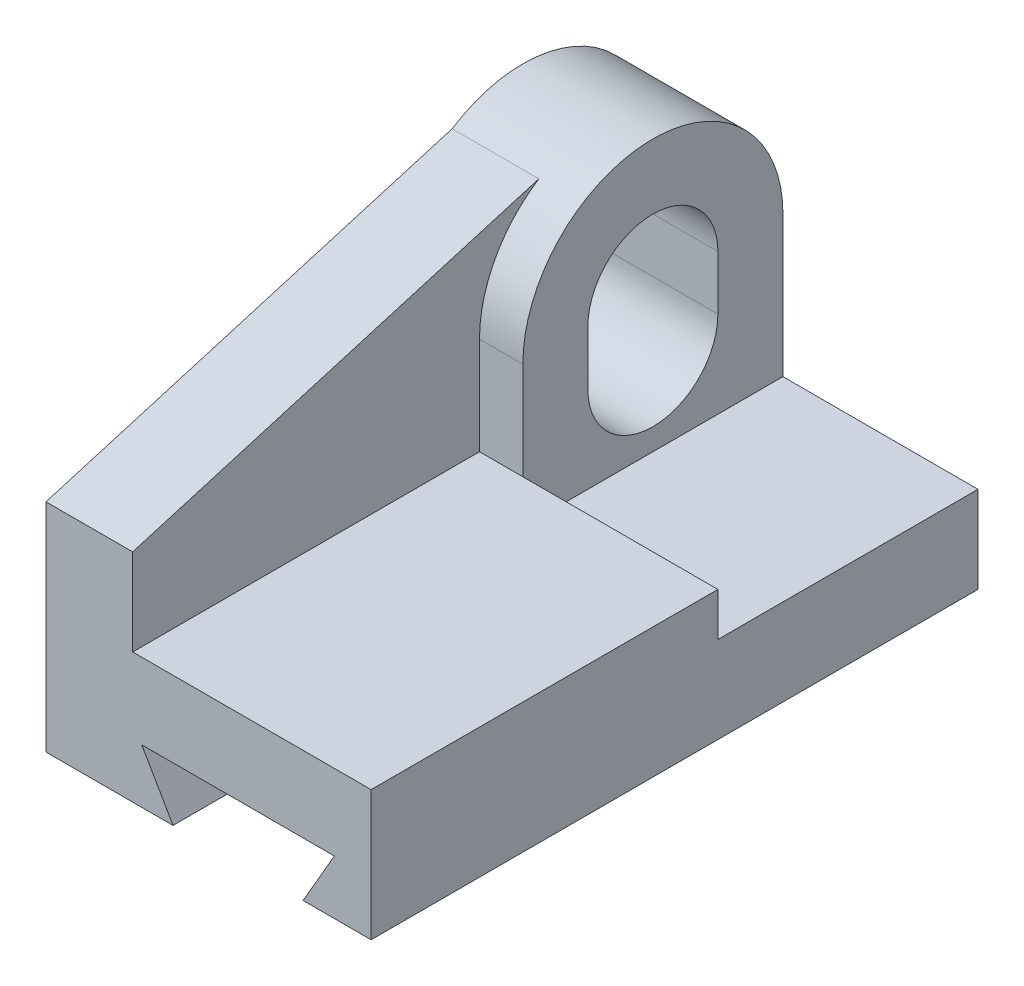
ISO-10303-21;
HEADER;
FILE_DESCRIPTION(('STEP AP214'),'2;1');
FILE_NAME('part.step','',(''),(''),'','','');
FILE_SCHEMA(('AUTOMOTIVE_DESIGN { 1 0 10303 214 1 1 1 1 }'));
ENDSEC;
DATA;
#1=APPLICATION_CONTEXT('core data for automotive mechanical design processes');
#2=APPLICATION_PROTOCOL_DEFINITION('international standard','automotive_design',2000,#1);
#3=PRODUCT_CONTEXT('',#1,'mechanical');
#4=PRODUCT('Part','Part','',(#3));
#5=PRODUCT_RELATED_PRODUCT_CATEGORY('part','',(#4));
#6=PRODUCT_DEFINITION_FORMATION('','',#4);
#7=PRODUCT_DEFINITION_CONTEXT('part definition',#1,'design');
#8=PRODUCT_DEFINITION('design','',#6,#7);
#9=PRODUCT_DEFINITION_SHAPE('','',#8);
#10=(LENGTH_UNIT() NAMED_UNIT(*) SI_UNIT(.MILLI.,.METRE.));
#11=(NAMED_UNIT(*) PLANE_ANGLE_UNIT() SI_UNIT($,.RADIAN.));
#12=(NAMED_UNIT(*) SI_UNIT($,.STERADIAN.) SOLID_ANGLE_UNIT());
#13=UNCERTAINTY_MEASURE_WITH_UNIT(LENGTH_MEASURE(1.E-05),#10,'distance_accuracy_value','');
#14=(GEOMETRIC_REPRESENTATION_CONTEXT(3) GLOBAL_UNCERTAINTY_ASSIGNED_CONTEXT((#13)) GLOBAL_UNIT_ASSIGNED_CONTEXT((#10,
#11,#12)) REPRESENTATION_CONTEXT('',''));
#15=CARTESIAN_POINT('',(0.,0.,0.));
#16=DIRECTION('',(0.,0.,1.));
#17=DIRECTION('',(1.,0.,0.));
#18=AXIS2_PLACEMENT_3D('',#15,#16,#17);
#19=CARTESIAN_POINT('',(30.,0.,0.));
#20=DIRECTION('',(0.,1.,0.));
#21=DIRECTION('',(0.,0.,1.));
#22=AXIS2_PLACEMENT_3D('',#19,#20,#21);
#23=PLANE('',#22);
#24=DIRECTION('',(-1.,0.,0.));
#25=VECTOR('',#24,1.);
#26=CARTESIAN_POINT('',(30.,0.,-56.));
#27=LINE('',#26,#25);
#28=CARTESIAN_POINT('',(11.7207890482263,0.,-56.));
#29=VERTEX_POINT('',#28);
#30=CARTESIAN_POINT('',(0.,0.,-56.));
#31=VERTEX_POINT('',#30);
#32=EDGE_CURVE('E196',#29,#31,#27,.T.);
#33=ORIENTED_EDGE('',*,*,#32,.F.);
#34=DIRECTION('',(0.,0.,1.));
#35=VECTOR('',#34,1.);
#36=CARTESIAN_POINT('',(11.7207890482263,0.,-56.));
#37=LINE('',#36,#35);
#38=CARTESIAN_POINT('',(11.7207890482263,0.,0.));
#39=VERTEX_POINT('',#38);
#40=EDGE_CURVE('E226',#29,#39,#37,.T.);
#41=ORIENTED_EDGE('',*,*,#40,.T.);
#42=DIRECTION('',(-1.,0.,0.));
#43=VECTOR('',#42,1.);
#44=CARTESIAN_POINT('',(30.,0.,0.));
#45=LINE('',#44,#43);
#46=CARTESIAN_POINT('',(0.,0.,0.));
#47=VERTEX_POINT('',#46);
#48=EDGE_CURVE('E195',#39,#47,#45,.T.);
#49=ORIENTED_EDGE('',*,*,#48,.T.);
#50=DIRECTION('',(0.,0.,-1.));
#51=VECTOR('',#50,1.);
#52=CARTESIAN_POINT('',(0.,0.,0.));
#53=LINE('',#52,#51);
#54=EDGE_CURVE('E307',#47,#31,#53,.T.);
#55=ORIENTED_EDGE('',*,*,#54,.T.);
#56=EDGE_LOOP('',(#33,#41,#49,#55));
#57=FACE_BOUND('',#56,.T.);
#58=ADVANCED_FACE('F43',(#57),#23,.F.);
#59=CARTESIAN_POINT('',(30.,12.,0.));
#60=DIRECTION('',(0.,1.,0.));
#61=DIRECTION('',(0.,0.,1.));
#62=AXIS2_PLACEMENT_3D('',#59,#60,#61);
#63=PLANE('',#62);
#64=DIRECTION('',(-1.,0.,0.));
#65=VECTOR('',#64,1.);
#66=CARTESIAN_POINT('',(30.,12.,-32.));
#67=LINE('',#66,#65);
#68=CARTESIAN_POINT('',(12.,12.,-32.));
#69=VERTEX_POINT('',#68);
#70=CARTESIAN_POINT('',(8.,12.,-32.));
#71=VERTEX_POINT('',#70);
#72=EDGE_CURVE('E277',#69,#71,#67,.T.);
#73=ORIENTED_EDGE('',*,*,#72,.T.);
#74=DIRECTION('',(0.,0.,-1.));
#75=VECTOR('',#74,1.);
#76=CARTESIAN_POINT('',(8.,12.,0.));
#77=LINE('',#76,#75);
#78=CARTESIAN_POINT('',(8.,12.,0.));
#79=VERTEX_POINT('',#78);
#80=EDGE_CURVE('E66',#79,#71,#77,.T.);
#81=ORIENTED_EDGE('',*,*,#80,.F.);
#82=DIRECTION('',(-1.,0.,0.));
#83=VECTOR('',#82,1.);
#84=CARTESIAN_POINT('',(30.,12.,0.));
#85=LINE('',#84,#83);
#86=CARTESIAN_POINT('',(30.,12.,0.));
#87=VERTEX_POINT('',#86);
#88=EDGE_CURVE('E51',#87,#79,#85,.T.);
#89=ORIENTED_EDGE('',*,*,#88,.F.);
#90=DIRECTION('',(0.,0.,-1.));
#91=VECTOR('',#90,1.);
#92=CARTESIAN_POINT('',(30.,12.,0.));
#93=LINE('',#92,#91);
#94=CARTESIAN_POINT('',(30.,12.,-32.));
#95=VERTEX_POINT('',#94);
#96=EDGE_CURVE('E295',#87,#95,#93,.T.);
#97=ORIENTED_EDGE('',*,*,#96,.T.);
#98=DIRECTION('',(-1.,0.,0.));
#99=VECTOR('',#98,1.);
#100=CARTESIAN_POINT('',(30.,12.,-32.));
#101=LINE('',#100,#99);
#102=EDGE_CURVE('E11',#95,#69,#101,.T.);
#103=ORIENTED_EDGE('',*,*,#102,.T.);
#104=EDGE_LOOP('',(#73,#81,#89,#97,#103));
#105=FACE_BOUND('',#104,.T.);
#106=ADVANCED_FACE('F325',(#105),#63,.T.);
#107=CARTESIAN_POINT('',(12.,0.,-32.));
#108=DIRECTION('',(0.,0.,-1.));
#109=DIRECTION('',(-1.,0.,0.));
#110=AXIS2_PLACEMENT_3D('',#107,#108,#109);
#111=PLANE('',#110);
#112=DIRECTION('',(0.,1.,0.));
#113=VECTOR('',#112,1.);
#114=CARTESIAN_POINT('',(8.,0.,-32.));
#115=LINE('',#114,#113);
#116=CARTESIAN_POINT('',(8.,21.,-32.));
#117=VERTEX_POINT('',#116);
#118=EDGE_CURVE('E231',#71,#117,#115,.T.);
#119=ORIENTED_EDGE('',*,*,#118,.F.);
#120=ORIENTED_EDGE('',*,*,#72,.F.);
#121=DIRECTION('',(0.,-1.,0.));
#122=VECTOR('',#121,1.);
#123=CARTESIAN_POINT('',(12.,0.,-32.));
#124=LINE('',#123,#122);
#125=CARTESIAN_POINT('',(12.,21.,-32.));
#126=VERTEX_POINT('',#125);
#127=EDGE_CURVE('E252',#126,#69,#124,.T.);
#128=ORIENTED_EDGE('',*,*,#127,.F.);
#129=DIRECTION('',(-1.,0.,0.));
#130=VECTOR('',#129,1.);
#131=CARTESIAN_POINT('',(12.,21.,-32.));
#132=LINE('',#131,#130);
#133=EDGE_CURVE('E278',#126,#117,#132,.T.);
#134=ORIENTED_EDGE('',*,*,#133,.T.);
#135=EDGE_LOOP('',(#119,#120,#128,#134));
#136=FACE_BOUND('',#135,.T.);
#137=ADVANCED_FACE('F349',(#136),#111,.F.);
#138=CARTESIAN_POINT('',(12.,21.,-44.));
#139=DIRECTION('',(-1.,0.,0.));
#140=DIRECTION('',(0.,0.,1.));
#141=AXIS2_PLACEMENT_3D('',#138,#139,#140);
#142=CYLINDRICAL_SURFACE('',#141,12.);
#143=DIRECTION('',(-1.,0.,0.));
#144=VECTOR('',#143,1.);
#145=CARTESIAN_POINT('',(8.,31.0731591448931,-37.4783847980998));
#146=LINE('',#145,#144);
#147=CARTESIAN_POINT('',(8.,31.0731591448931,-37.4783847980998));
#148=VERTEX_POINT('',#147);
#149=CARTESIAN_POINT('',(0.,31.0731591448931,-37.4783847980998));
#150=VERTEX_POINT('',#149);
#151=EDGE_CURVE('E235',#148,#150,#146,.T.);
#152=ORIENTED_EDGE('',*,*,#151,.F.);
#153=CARTESIAN_POINT('',(8.,21.,-44.));
#154=DIRECTION('',(-1.,0.,0.));
#155=DIRECTION('',(0.,0.,1.));
#156=AXIS2_PLACEMENT_3D('',#153,#154,#155);
#157=CIRCLE('',#156,12.);
#158=EDGE_CURVE('E223',#117,#148,#157,.T.);
#159=ORIENTED_EDGE('',*,*,#158,.F.);
#160=ORIENTED_EDGE('',*,*,#133,.F.);
#161=CARTESIAN_POINT('',(12.,21.,-44.));
#162=DIRECTION('',(-1.,0.,0.));
#163=DIRECTION('',(0.,0.,1.));
#164=AXIS2_PLACEMENT_3D('',#161,#162,#163);
#165=CIRCLE('',#164,12.);
#166=CARTESIAN_POINT('',(12.,21.,-56.));
#167=VERTEX_POINT('',#166);
#168=EDGE_CURVE('E255',#167,#126,#165,.F.);
#169=ORIENTED_EDGE('',*,*,#168,.F.);
#170=DIRECTION('',(-1.,0.,0.));
#171=VECTOR('',#170,1.);
#172=CARTESIAN_POINT('',(12.,21.,-56.));
#173=LINE('',#172,#171);
#174=CARTESIAN_POINT('',(0.,21.,-56.));
#175=VERTEX_POINT('',#174);
#176=EDGE_CURVE('E274',#167,#175,#173,.T.);
#177=ORIENTED_EDGE('',*,*,#176,.T.);
#178=CARTESIAN_POINT('',(0.,21.,-44.));
#179=DIRECTION('',(-1.,0.,0.));
#180=DIRECTION('',(0.,0.,1.));
#181=AXIS2_PLACEMENT_3D('',#178,#179,#180);
#182=CIRCLE('',#181,12.);
#183=EDGE_CURVE('E244',#175,#150,#182,.F.);
#184=ORIENTED_EDGE('',*,*,#183,.T.);
#185=EDGE_LOOP('',(#152,#159,#160,#169,#177,#184));
#186=FACE_BOUND('',#185,.T.);
#187=ADVANCED_FACE('F362',(#186),#142,.T.);
#188=CARTESIAN_POINT('',(30.,0.,-32.));
#189=DIRECTION('',(0.,0.,-1.));
#190=DIRECTION('',(-1.,0.,0.));
#191=AXIS2_PLACEMENT_3D('',#188,#189,#190);
#192=PLANE('',#191);
#193=DIRECTION('',(-1.,0.,0.));
#194=VECTOR('',#193,1.);
#195=CARTESIAN_POINT('',(30.,8.,-32.));
#196=LINE('',#195,#194);
#197=CARTESIAN_POINT('',(30.,8.,-32.));
#198=VERTEX_POINT('',#197);
#199=CARTESIAN_POINT('',(12.,8.,-32.));
#200=VERTEX_POINT('',#199);
#201=EDGE_CURVE('E305',#198,#200,#196,.T.);
#202=ORIENTED_EDGE('',*,*,#201,.T.);
#203=EDGE_CURVE('E251',#69,#200,#124,.T.);
#204=ORIENTED_EDGE('',*,*,#203,.F.);
#205=ORIENTED_EDGE('',*,*,#102,.F.);
#206=DIRECTION('',(0.,-1.,0.));
#207=VECTOR('',#206,1.);
#208=CARTESIAN_POINT('',(30.,0.,-32.));
#209=LINE('',#208,#207);
#210=EDGE_CURVE('E292',#95,#198,#209,.T.);
#211=ORIENTED_EDGE('',*,*,#210,.T.);
#212=EDGE_LOOP('',(#202,#204,#205,#211));
#213=FACE_BOUND('',#212,.T.);
#214=ADVANCED_FACE('F45',(#213),#192,.T.);
#215=CARTESIAN_POINT('',(30.,8.,0.));
#216=DIRECTION('',(0.,1.,0.));
#217=DIRECTION('',(0.,0.,1.));
#218=AXIS2_PLACEMENT_3D('',#215,#216,#217);
#219=PLANE('',#218);
#220=DIRECTION('',(-1.,0.,0.));
#221=VECTOR('',#220,1.);
#222=CARTESIAN_POINT('',(30.,8.,-56.));
#223=LINE('',#222,#221);
#224=CARTESIAN_POINT('',(30.,8.,-56.));
#225=VERTEX_POINT('',#224);
#226=CARTESIAN_POINT('',(12.,8.,-56.));
#227=VERTEX_POINT('',#226);
#228=EDGE_CURVE('E199',#225,#227,#223,.T.);
#229=ORIENTED_EDGE('',*,*,#228,.T.);
#230=DIRECTION('',(0.,0.,-1.));
#231=VECTOR('',#230,1.);
#232=CARTESIAN_POINT('',(12.,8.,0.));
#233=LINE('',#232,#231);
#234=EDGE_CURVE('E260',#200,#227,#233,.T.);
#235=ORIENTED_EDGE('',*,*,#234,.F.);
#236=ORIENTED_EDGE('',*,*,#201,.F.);
#237=DIRECTION('',(0.,0.,-1.));
#238=VECTOR('',#237,1.);
#239=CARTESIAN_POINT('',(30.,8.,0.));
#240=LINE('',#239,#238);
#241=EDGE_CURVE('E302',#198,#225,#240,.T.);
#242=ORIENTED_EDGE('',*,*,#241,.T.);
#243=EDGE_LOOP('',(#229,#235,#236,#242));
#244=FACE_BOUND('',#243,.T.);
#245=ADVANCED_FACE('F316',(#244),#219,.T.);
#246=CARTESIAN_POINT('',(30.,0.,0.));
#247=DIRECTION('',(0.,0.,1.));
#248=DIRECTION('',(1.,0.,0.));
#249=AXIS2_PLACEMENT_3D('',#246,#247,#248);
#250=PLANE('',#249);
#251=DIRECTION('',(0.499999999999998,-0.86602540378444,0.));
#252=VECTOR('',#251,1.);
#253=CARTESIAN_POINT('',(11.7207890482263,0.,0.));
#254=LINE('',#253,#252);
#255=CARTESIAN_POINT('',(8.83403770227823,5.,0.));
#256=VERTEX_POINT('',#255);
#257=EDGE_CURVE('E180',#256,#39,#254,.T.);
#258=ORIENTED_EDGE('',*,*,#257,.F.);
#259=DIRECTION('',(-1.,0.,0.));
#260=VECTOR('',#259,1.);
#261=CARTESIAN_POINT('',(8.83403770227823,5.,0.));
#262=LINE('',#261,#260);
#263=CARTESIAN_POINT('',(26.6075403941745,5.,0.));
#264=VERTEX_POINT('',#263);
#265=EDGE_CURVE('E428',#264,#256,#262,.T.);
#266=ORIENTED_EDGE('',*,*,#265,.F.);
#267=DIRECTION('',(0.499999999999998,0.86602540378444,0.));
#268=VECTOR('',#267,1.);
#269=CARTESIAN_POINT('',(23.7207890482264,0.,0.));
#270=LINE('',#269,#268);
#271=CARTESIAN_POINT('',(23.7207890482264,0.,0.));
#272=VERTEX_POINT('',#271);
#273=EDGE_CURVE('E439',#272,#264,#270,.T.);
#274=ORIENTED_EDGE('',*,*,#273,.F.);
#275=CARTESIAN_POINT('',(30.,0.,0.));
#276=VERTEX_POINT('',#275);
#277=EDGE_CURVE('E189',#276,#272,#45,.T.);
#278=ORIENTED_EDGE('',*,*,#277,.F.);
#279=DIRECTION('',(0.,1.,0.));
#280=VECTOR('',#279,1.);
#281=CARTESIAN_POINT('',(30.,0.,0.));
#282=LINE('',#281,#280);
#283=EDGE_CURVE('E211',#276,#87,#282,.T.);
#284=ORIENTED_EDGE('',*,*,#283,.T.);
#285=ORIENTED_EDGE('',*,*,#88,.T.);
#286=DIRECTION('',(0.,-1.,0.));
#287=VECTOR('',#286,1.);
#288=CARTESIAN_POINT('',(8.,0.,0.));
#289=LINE('',#288,#287);
#290=CARTESIAN_POINT('',(8.,20.,0.));
#291=VERTEX_POINT('',#290);
#292=EDGE_CURVE('E209',#291,#79,#289,.T.);
#293=ORIENTED_EDGE('',*,*,#292,.F.);
#294=DIRECTION('',(-1.,0.,0.));
#295=VECTOR('',#294,1.);
#296=CARTESIAN_POINT('',(8.,20.,0.));
#297=LINE('',#296,#295);
#298=CARTESIAN_POINT('',(0.,20.,0.));
#299=VERTEX_POINT('',#298);
#300=EDGE_CURVE('E233',#291,#299,#297,.T.);
#301=ORIENTED_EDGE('',*,*,#300,.T.);
#302=DIRECTION('',(0.,1.,0.));
#303=VECTOR('',#302,1.);
#304=CARTESIAN_POINT('',(0.,0.,0.));
#305=LINE('',#304,#303);
#306=EDGE_CURVE('E291',#47,#299,#305,.T.);
#307=ORIENTED_EDGE('',*,*,#306,.F.);
#308=ORIENTED_EDGE('',*,*,#48,.F.);
#309=EDGE_LOOP('',(#258,#266,#274,#278,#284,#285,#293,#301,#307,#308));
#310=FACE_BOUND('',#309,.T.);
#311=ADVANCED_FACE('F207',(#310),#250,.T.);
#312=ORIENTED_EDGE('',*,*,#277,.T.);
#313=DIRECTION('',(0.,0.,1.));
#314=VECTOR('',#313,1.);
#315=CARTESIAN_POINT('',(23.7207890482264,0.,-56.));
#316=LINE('',#315,#314);
#317=CARTESIAN_POINT('',(23.7207890482264,0.,-56.));
#318=VERTEX_POINT('',#317);
#319=EDGE_CURVE('E175',#318,#272,#316,.T.);
#320=ORIENTED_EDGE('',*,*,#319,.F.);
#321=CARTESIAN_POINT('',(30.,0.,-56.));
#322=VERTEX_POINT('',#321);
#323=EDGE_CURVE('E187',#322,#318,#27,.T.);
#324=ORIENTED_EDGE('',*,*,#323,.F.);
#325=DIRECTION('',(0.,0.,-1.));
#326=VECTOR('',#325,1.);
#327=CARTESIAN_POINT('',(30.,0.,0.));
#328=LINE('',#327,#326);
#329=EDGE_CURVE('E299',#276,#322,#328,.T.);
#330=ORIENTED_EDGE('',*,*,#329,.F.);
#331=EDGE_LOOP('',(#312,#320,#324,#330));
#332=FACE_BOUND('',#331,.T.);
#333=ADVANCED_FACE('F185',(#332),#23,.F.);
#334=CARTESIAN_POINT('',(30.,0.,-56.));
#335=DIRECTION('',(0.,0.,1.));
#336=DIRECTION('',(1.,0.,0.));
#337=AXIS2_PLACEMENT_3D('',#334,#335,#336);
#338=PLANE('',#337);
#339=DIRECTION('',(-1.,0.,0.));
#340=VECTOR('',#339,1.);
#341=CARTESIAN_POINT('',(8.83403770227823,5.,-56.));
#342=LINE('',#341,#340);
#343=CARTESIAN_POINT('',(26.6075403941745,5.,-56.));
#344=VERTEX_POINT('',#343);
#345=CARTESIAN_POINT('',(8.83403770227823,5.,-56.));
#346=VERTEX_POINT('',#345);
#347=EDGE_CURVE('E58',#344,#346,#342,.T.);
#348=ORIENTED_EDGE('',*,*,#347,.T.);
#349=DIRECTION('',(0.499999999999998,-0.86602540378444,0.));
#350=VECTOR('',#349,1.);
#351=CARTESIAN_POINT('',(11.7207890482263,0.,-56.));
#352=LINE('',#351,#350);
#353=EDGE_CURVE('E190',#346,#29,#352,.T.);
#354=ORIENTED_EDGE('',*,*,#353,.T.);
#355=ORIENTED_EDGE('',*,*,#32,.T.);
#356=DIRECTION('',(0.,1.,0.));
#357=VECTOR('',#356,1.);
#358=CARTESIAN_POINT('',(0.,0.,-56.));
#359=LINE('',#358,#357);
#360=EDGE_CURVE('E296',#31,#175,#359,.T.);
#361=ORIENTED_EDGE('',*,*,#360,.T.);
#362=ORIENTED_EDGE('',*,*,#176,.F.);
#363=DIRECTION('',(0.,-1.,0.));
#364=VECTOR('',#363,1.);
#365=CARTESIAN_POINT('',(12.,0.,-56.));
#366=LINE('',#365,#364);
#367=EDGE_CURVE('E257',#167,#227,#366,.T.);
#368=ORIENTED_EDGE('',*,*,#367,.T.);
#369=ORIENTED_EDGE('',*,*,#228,.F.);
#370=DIRECTION('',(0.,1.,0.));
#371=VECTOR('',#370,1.);
#372=CARTESIAN_POINT('',(30.,0.,-56.));
#373=LINE('',#372,#371);
#374=EDGE_CURVE('E194',#322,#225,#373,.T.);
#375=ORIENTED_EDGE('',*,*,#374,.F.);
#376=ORIENTED_EDGE('',*,*,#323,.T.);
#377=DIRECTION('',(0.499999999999998,0.86602540378444,0.));
#378=VECTOR('',#377,1.);
#379=CARTESIAN_POINT('',(23.7207890482264,0.,-56.));
#380=LINE('',#379,#378);
#381=EDGE_CURVE('E171',#318,#344,#380,.T.);
#382=ORIENTED_EDGE('',*,*,#381,.T.);
#383=EDGE_LOOP('',(#348,#354,#355,#361,#362,#368,#369,#375,#376,#382));
#384=FACE_BOUND('',#383,.T.);
#385=ADVANCED_FACE('F192',(#384),#338,.F.);
#386=CARTESIAN_POINT('',(30.,0.,0.));
#387=DIRECTION('',(1.,0.,0.));
#388=DIRECTION('',(0.,0.,-1.));
#389=AXIS2_PLACEMENT_3D('',#386,#387,#388);
#390=PLANE('',#389);
#391=ORIENTED_EDGE('',*,*,#210,.F.);
#392=ORIENTED_EDGE('',*,*,#96,.F.);
#393=ORIENTED_EDGE('',*,*,#283,.F.);
#394=ORIENTED_EDGE('',*,*,#329,.T.);
#395=ORIENTED_EDGE('',*,*,#374,.T.);
#396=ORIENTED_EDGE('',*,*,#241,.F.);
#397=EDGE_LOOP('',(#391,#392,#393,#394,#395,#396));
#398=FACE_BOUND('',#397,.T.);
#399=ADVANCED_FACE('F327',(#398),#390,.T.);
#400=CARTESIAN_POINT('',(0.,0.,0.));
#401=DIRECTION('',(1.,0.,0.));
#402=DIRECTION('',(0.,0.,-1.));
#403=AXIS2_PLACEMENT_3D('',#400,#401,#402);
#404=PLANE('',#403);
#405=ORIENTED_EDGE('',*,*,#306,.T.);
#406=DIRECTION('',(0.,-0.283346141017402,0.9590177080589));
#407=VECTOR('',#406,1.);
#408=CARTESIAN_POINT('',(0.,18.3942992874109,5.43467933491686));
#409=LINE('',#408,#407);
#410=EDGE_CURVE('E221',#150,#299,#409,.T.);
#411=ORIENTED_EDGE('',*,*,#410,.F.);
#412=ORIENTED_EDGE('',*,*,#183,.F.);
#413=ORIENTED_EDGE('',*,*,#360,.F.);
#414=ORIENTED_EDGE('',*,*,#54,.F.);
#415=EDGE_LOOP('',(#405,#411,#412,#413,#414));
#416=FACE_BOUND('',#415,.T.);
#417=CARTESIAN_POINT('',(0.,21.,-44.));
#418=DIRECTION('',(-1.,0.,0.));
#419=DIRECTION('',(0.,0.,1.));
#420=AXIS2_PLACEMENT_3D('',#417,#418,#419);
#421=CIRCLE('',#420,6.00000000000001);
#422=CARTESIAN_POINT('',(0.,21.,-38.));
#423=VERTEX_POINT('',#422);
#424=CARTESIAN_POINT('',(0.,21.,-50.));
#425=VERTEX_POINT('',#424);
#426=EDGE_CURVE('E238',#423,#425,#421,.T.);
#427=ORIENTED_EDGE('',*,*,#426,.F.);
#428=DIRECTION('',(0.,-1.,0.));
#429=VECTOR('',#428,1.);
#430=CARTESIAN_POINT('',(0.,0.,-38.));
#431=LINE('',#430,#429);
#432=CARTESIAN_POINT('',(0.,16.,-38.));
#433=VERTEX_POINT('',#432);
#434=EDGE_CURVE('E265',#423,#433,#431,.T.);
#435=ORIENTED_EDGE('',*,*,#434,.T.);
#436=CARTESIAN_POINT('',(0.,16.,-44.));
#437=DIRECTION('',(-1.,0.,0.));
#438=DIRECTION('',(0.,0.,1.));
#439=AXIS2_PLACEMENT_3D('',#436,#437,#438);
#440=CIRCLE('',#439,6.00000000000001);
#441=CARTESIAN_POINT('',(0.,16.,-50.));
#442=VERTEX_POINT('',#441);
#443=EDGE_CURVE('E268',#442,#433,#440,.T.);
#444=ORIENTED_EDGE('',*,*,#443,.F.);
#445=DIRECTION('',(0.,-1.,0.));
#446=VECTOR('',#445,1.);
#447=CARTESIAN_POINT('',(0.,0.,-50.));
#448=LINE('',#447,#446);
#449=EDGE_CURVE('E271',#425,#442,#448,.T.);
#450=ORIENTED_EDGE('',*,*,#449,.F.);
#451=EDGE_LOOP('',(#427,#435,#444,#450));
#452=FACE_BOUND('',#451,.T.);
#453=ADVANCED_FACE('F329',(#416,#452),#404,.F.);
#454=CARTESIAN_POINT('',(12.,21.,-44.));
#455=DIRECTION('',(-1.,0.,0.));
#456=DIRECTION('',(0.,0.,1.));
#457=AXIS2_PLACEMENT_3D('',#454,#455,#456);
#458=CYLINDRICAL_SURFACE('',#457,6.00000000000001);
#459=ORIENTED_EDGE('',*,*,#426,.T.);
#460=DIRECTION('',(-1.,0.,0.));
#461=VECTOR('',#460,1.);
#462=CARTESIAN_POINT('',(12.,21.,-50.));
#463=LINE('',#462,#461);
#464=CARTESIAN_POINT('',(12.,21.,-50.));
#465=VERTEX_POINT('',#464);
#466=EDGE_CURVE('E281',#465,#425,#463,.T.);
#467=ORIENTED_EDGE('',*,*,#466,.F.);
#468=CARTESIAN_POINT('',(12.,21.,-44.));
#469=DIRECTION('',(-1.,0.,0.));
#470=DIRECTION('',(0.,0.,1.));
#471=AXIS2_PLACEMENT_3D('',#468,#469,#470);
#472=CIRCLE('',#471,6.00000000000001);
#473=CARTESIAN_POINT('',(12.,21.,-38.));
#474=VERTEX_POINT('',#473);
#475=EDGE_CURVE('E240',#474,#465,#472,.T.);
#476=ORIENTED_EDGE('',*,*,#475,.F.);
#477=DIRECTION('',(-1.,0.,0.));
#478=VECTOR('',#477,1.);
#479=CARTESIAN_POINT('',(12.,21.,-38.));
#480=LINE('',#479,#478);
#481=EDGE_CURVE('E262',#474,#423,#480,.T.);
#482=ORIENTED_EDGE('',*,*,#481,.T.);
#483=EDGE_LOOP('',(#459,#467,#476,#482));
#484=FACE_BOUND('',#483,.T.);
#485=ADVANCED_FACE('F335',(#484),#458,.F.);
#486=CARTESIAN_POINT('',(12.,0.,-50.));
#487=DIRECTION('',(0.,0.,-1.));
#488=DIRECTION('',(-1.,0.,0.));
#489=AXIS2_PLACEMENT_3D('',#486,#487,#488);
#490=PLANE('',#489);
#491=ORIENTED_EDGE('',*,*,#449,.T.);
#492=DIRECTION('',(-1.,0.,0.));
#493=VECTOR('',#492,1.);
#494=CARTESIAN_POINT('',(12.,16.,-50.));
#495=LINE('',#494,#493);
#496=CARTESIAN_POINT('',(12.,16.,-50.));
#497=VERTEX_POINT('',#496);
#498=EDGE_CURVE('E284',#497,#442,#495,.T.);
#499=ORIENTED_EDGE('',*,*,#498,.F.);
#500=DIRECTION('',(0.,-1.,0.));
#501=VECTOR('',#500,1.);
#502=CARTESIAN_POINT('',(12.,0.,-50.));
#503=LINE('',#502,#501);
#504=EDGE_CURVE('E249',#465,#497,#503,.T.);
#505=ORIENTED_EDGE('',*,*,#504,.F.);
#506=ORIENTED_EDGE('',*,*,#466,.T.);
#507=EDGE_LOOP('',(#491,#499,#505,#506));
#508=FACE_BOUND('',#507,.T.);
#509=ADVANCED_FACE('F376',(#508),#490,.F.);
#510=CARTESIAN_POINT('',(12.,16.,-44.));
#511=DIRECTION('',(-1.,0.,0.));
#512=DIRECTION('',(0.,0.,1.));
#513=AXIS2_PLACEMENT_3D('',#510,#511,#512);
#514=CYLINDRICAL_SURFACE('',#513,6.00000000000001);
#515=ORIENTED_EDGE('',*,*,#443,.T.);
#516=DIRECTION('',(-1.,0.,0.));
#517=VECTOR('',#516,1.);
#518=CARTESIAN_POINT('',(12.,16.,-38.));
#519=LINE('',#518,#517);
#520=CARTESIAN_POINT('',(12.,16.,-38.));
#521=VERTEX_POINT('',#520);
#522=EDGE_CURVE('E287',#521,#433,#519,.T.);
#523=ORIENTED_EDGE('',*,*,#522,.F.);
#524=CARTESIAN_POINT('',(12.,16.,-44.));
#525=DIRECTION('',(-1.,0.,0.));
#526=DIRECTION('',(0.,0.,1.));
#527=AXIS2_PLACEMENT_3D('',#524,#525,#526);
#528=CIRCLE('',#527,6.00000000000001);
#529=EDGE_CURVE('E247',#497,#521,#528,.T.);
#530=ORIENTED_EDGE('',*,*,#529,.F.);
#531=ORIENTED_EDGE('',*,*,#498,.T.);
#532=EDGE_LOOP('',(#515,#523,#530,#531));
#533=FACE_BOUND('',#532,.T.);
#534=ADVANCED_FACE('F379',(#533),#514,.F.);
#535=CARTESIAN_POINT('',(12.,0.,-38.));
#536=DIRECTION('',(0.,0.,-1.));
#537=DIRECTION('',(-1.,0.,0.));
#538=AXIS2_PLACEMENT_3D('',#535,#536,#537);
#539=PLANE('',#538);
#540=ORIENTED_EDGE('',*,*,#434,.F.);
#541=ORIENTED_EDGE('',*,*,#481,.F.);
#542=DIRECTION('',(0.,-1.,0.));
#543=VECTOR('',#542,1.);
#544=CARTESIAN_POINT('',(12.,0.,-38.));
#545=LINE('',#544,#543);
#546=EDGE_CURVE('E243',#474,#521,#545,.T.);
#547=ORIENTED_EDGE('',*,*,#546,.T.);
#548=ORIENTED_EDGE('',*,*,#522,.T.);
#549=EDGE_LOOP('',(#540,#541,#547,#548));
#550=FACE_BOUND('',#549,.T.);
#551=ADVANCED_FACE('F383',(#550),#539,.T.);
#552=CARTESIAN_POINT('',(12.,0.,0.));
#553=DIRECTION('',(-1.,0.,0.));
#554=DIRECTION('',(0.,0.,1.));
#555=AXIS2_PLACEMENT_3D('',#552,#553,#554);
#556=PLANE('',#555);
#557=ORIENTED_EDGE('',*,*,#475,.T.);
#558=ORIENTED_EDGE('',*,*,#504,.T.);
#559=ORIENTED_EDGE('',*,*,#529,.T.);
#560=ORIENTED_EDGE('',*,*,#546,.F.);
#561=EDGE_LOOP('',(#557,#558,#559,#560));
#562=FACE_BOUND('',#561,.T.);
#563=ORIENTED_EDGE('',*,*,#127,.T.);
#564=ORIENTED_EDGE('',*,*,#203,.T.);
#565=ORIENTED_EDGE('',*,*,#234,.T.);
#566=ORIENTED_EDGE('',*,*,#367,.F.);
#567=ORIENTED_EDGE('',*,*,#168,.T.);
#568=EDGE_LOOP('',(#563,#564,#565,#566,#567));
#569=FACE_BOUND('',#568,.T.);
#570=ADVANCED_FACE('F321',(#562,#569),#556,.F.);
#571=CARTESIAN_POINT('',(8.,18.3942992874109,5.43467933491686));
#572=DIRECTION('',(0.,-0.9590177080589,-0.283346141017402));
#573=DIRECTION('',(0.,0.283346141017402,-0.9590177080589));
#574=AXIS2_PLACEMENT_3D('',#571,#572,#573);
#575=PLANE('',#574);
#576=ORIENTED_EDGE('',*,*,#410,.T.);
#577=ORIENTED_EDGE('',*,*,#300,.F.);
#578=DIRECTION('',(0.,-0.283346141017402,0.9590177080589));
#579=VECTOR('',#578,1.);
#580=CARTESIAN_POINT('',(8.,18.3942992874109,5.43467933491686));
#581=LINE('',#580,#579);
#582=EDGE_CURVE('E219',#148,#291,#581,.T.);
#583=ORIENTED_EDGE('',*,*,#582,.F.);
#584=ORIENTED_EDGE('',*,*,#151,.T.);
#585=EDGE_LOOP('',(#576,#577,#583,#584));
#586=FACE_BOUND('',#585,.T.);
#587=ADVANCED_FACE('F402',(#586),#575,.F.);
#588=CARTESIAN_POINT('',(8.,0.,0.));
#589=DIRECTION('',(-1.,0.,0.));
#590=DIRECTION('',(0.,0.,1.));
#591=AXIS2_PLACEMENT_3D('',#588,#589,#590);
#592=PLANE('',#591);
#593=ORIENTED_EDGE('',*,*,#292,.T.);
#594=ORIENTED_EDGE('',*,*,#80,.T.);
#595=ORIENTED_EDGE('',*,*,#118,.T.);
#596=ORIENTED_EDGE('',*,*,#158,.T.);
#597=ORIENTED_EDGE('',*,*,#582,.T.);
#598=EDGE_LOOP('',(#593,#594,#595,#596,#597));
#599=FACE_BOUND('',#598,.T.);
#600=ADVANCED_FACE('F215',(#599),#592,.F.);
#601=CARTESIAN_POINT('',(11.7207890482263,0.,-56.));
#602=DIRECTION('',(-0.86602540378444,-0.499999999999998,0.));
#603=DIRECTION('',(0.499999999999998,-0.86602540378444,0.));
#604=AXIS2_PLACEMENT_3D('',#601,#602,#603);
#605=PLANE('',#604);
#606=ORIENTED_EDGE('',*,*,#257,.T.);
#607=ORIENTED_EDGE('',*,*,#40,.F.);
#608=ORIENTED_EDGE('',*,*,#353,.F.);
#609=DIRECTION('',(0.,0.,1.));
#610=VECTOR('',#609,1.);
#611=CARTESIAN_POINT('',(8.83403770227823,5.,-56.));
#612=LINE('',#611,#610);
#613=EDGE_CURVE('E424',#346,#256,#612,.T.);
#614=ORIENTED_EDGE('',*,*,#613,.T.);
#615=EDGE_LOOP('',(#606,#607,#608,#614));
#616=FACE_BOUND('',#615,.T.);
#617=ADVANCED_FACE('F409',(#616),#605,.F.);
#618=CARTESIAN_POINT('',(8.83403770227823,5.,-56.));
#619=DIRECTION('',(0.,1.,0.));
#620=DIRECTION('',(-1.,0.,0.));
#621=AXIS2_PLACEMENT_3D('',#618,#619,#620);
#622=PLANE('',#621);
#623=ORIENTED_EDGE('',*,*,#265,.T.);
#624=ORIENTED_EDGE('',*,*,#613,.F.);
#625=ORIENTED_EDGE('',*,*,#347,.F.);
#626=DIRECTION('',(0.,0.,1.));
#627=VECTOR('',#626,1.);
#628=CARTESIAN_POINT('',(26.6075403941745,5.,-56.));
#629=LINE('',#628,#627);
#630=EDGE_CURVE('E177',#344,#264,#629,.T.);
#631=ORIENTED_EDGE('',*,*,#630,.T.);
#632=EDGE_LOOP('',(#623,#624,#625,#631));
#633=FACE_BOUND('',#632,.T.);
#634=ADVANCED_FACE('F414',(#633),#622,.F.);
#635=CARTESIAN_POINT('',(23.7207890482264,0.,-56.));
#636=DIRECTION('',(0.86602540378444,-0.499999999999998,0.));
#637=DIRECTION('',(0.499999999999998,0.86602540378444,0.));
#638=AXIS2_PLACEMENT_3D('',#635,#636,#637);
#639=PLANE('',#638);
#640=ORIENTED_EDGE('',*,*,#273,.T.);
#641=ORIENTED_EDGE('',*,*,#630,.F.);
#642=ORIENTED_EDGE('',*,*,#381,.F.);
#643=ORIENTED_EDGE('',*,*,#319,.T.);
#644=EDGE_LOOP('',(#640,#641,#642,#643));
#645=FACE_BOUND('',#644,.T.);
#646=ADVANCED_FACE('F174',(#645),#639,.F.);
#647=CLOSED_SHELL('',(#58,#106,#137,#187,#214,#245,#311,#333,#385,#399,#453,#485,#509,#534,#551,
#570,#587,#600,#617,#634,#646));
#648=MANIFOLD_SOLID_BREP('B2',#647);
#649=ADVANCED_BREP_SHAPE_REPRESENTATION('',(#18,#648),#14);
#650=SHAPE_DEFINITION_REPRESENTATION(#9,#649);
ENDSEC;
END-ISO-10303-21;
